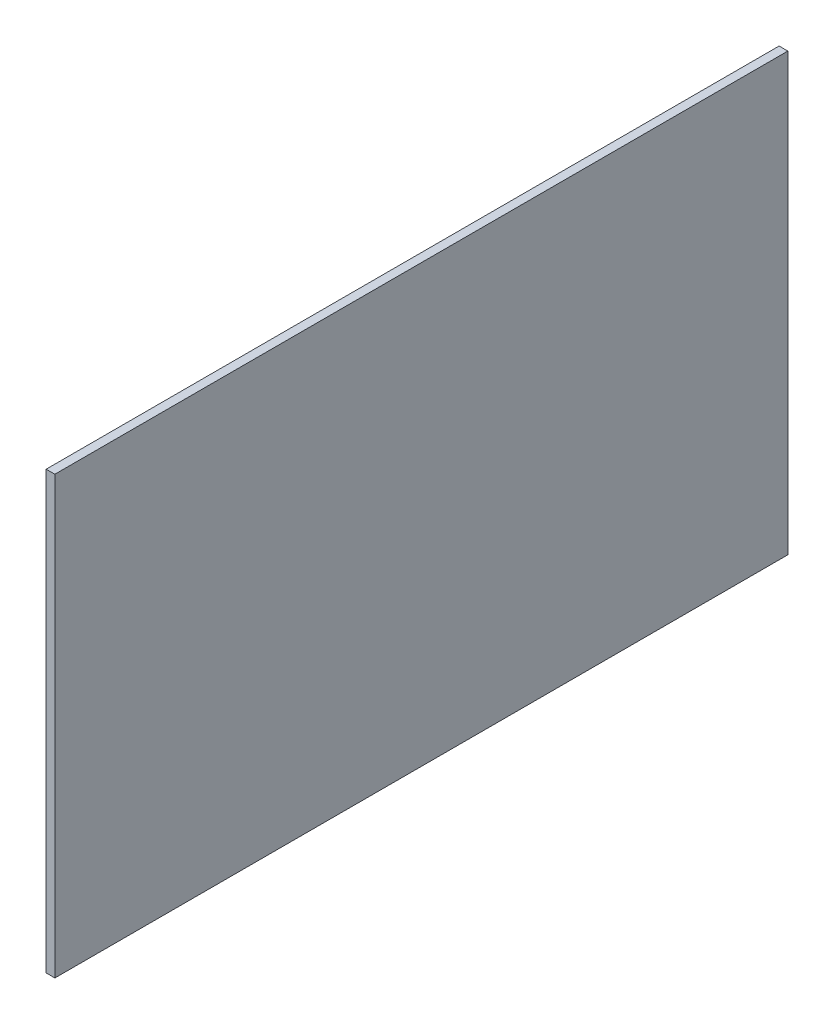
ISO-10303-21;
HEADER;
FILE_DESCRIPTION(('STEP AP214'),'2;1');
FILE_NAME('part.step','',(''),(''),'','','');
FILE_SCHEMA(('AUTOMOTIVE_DESIGN { 1 0 10303 214 1 1 1 1 }'));
ENDSEC;
DATA;
#1=APPLICATION_CONTEXT('core data for automotive mechanical design processes');
#2=APPLICATION_PROTOCOL_DEFINITION('international standard','automotive_design',2000,#1);
#3=PRODUCT_CONTEXT('',#1,'mechanical');
#4=PRODUCT('Part','Part','',(#3));
#5=PRODUCT_RELATED_PRODUCT_CATEGORY('part','',(#4));
#6=PRODUCT_DEFINITION_FORMATION('','',#4);
#7=PRODUCT_DEFINITION_CONTEXT('part definition',#1,'design');
#8=PRODUCT_DEFINITION('design','',#6,#7);
#9=PRODUCT_DEFINITION_SHAPE('','',#8);
#10=(LENGTH_UNIT() NAMED_UNIT(*) SI_UNIT(.MILLI.,.METRE.));
#11=(NAMED_UNIT(*) PLANE_ANGLE_UNIT() SI_UNIT($,.RADIAN.));
#12=(NAMED_UNIT(*) SI_UNIT($,.STERADIAN.) SOLID_ANGLE_UNIT());
#13=UNCERTAINTY_MEASURE_WITH_UNIT(LENGTH_MEASURE(1.E-05),#10,'distance_accuracy_value','');
#14=(GEOMETRIC_REPRESENTATION_CONTEXT(3) GLOBAL_UNCERTAINTY_ASSIGNED_CONTEXT((#13)) GLOBAL_UNIT_ASSIGNED_CONTEXT((#10,
#11,#12)) REPRESENTATION_CONTEXT('',''));
#15=CARTESIAN_POINT('',(0.,0.,0.));
#16=DIRECTION('',(0.,0.,1.));
#17=DIRECTION('',(1.,0.,0.));
#18=AXIS2_PLACEMENT_3D('',#15,#16,#17);
#19=CARTESIAN_POINT('',(304.8,8255.,-12801.6));
#20=DIRECTION('',(0.,0.,1.));
#21=DIRECTION('',(0.,-1.,0.));
#22=AXIS2_PLACEMENT_3D('',#19,#20,#21);
#23=PLANE('',#22);
#24=DIRECTION('',(0.,1.,0.));
#25=VECTOR('',#24,1.);
#26=CARTESIAN_POINT('',(0.,8255.,-12801.6));
#27=LINE('',#26,#25);
#28=CARTESIAN_POINT('',(0.,-6985.,-12801.6));
#29=VERTEX_POINT('',#28);
#30=CARTESIAN_POINT('',(0.,8255.,-12801.6));
#31=VERTEX_POINT('',#30);
#32=EDGE_CURVE('E98',#29,#31,#27,.T.);
#33=ORIENTED_EDGE('',*,*,#32,.T.);
#34=DIRECTION('',(-1.,0.,0.));
#35=VECTOR('',#34,1.);
#36=CARTESIAN_POINT('',(304.8,8255.,-12801.6));
#37=LINE('',#36,#35);
#38=CARTESIAN_POINT('',(304.8,8255.,-12801.6));
#39=VERTEX_POINT('',#38);
#40=EDGE_CURVE('E11',#39,#31,#37,.T.);
#41=ORIENTED_EDGE('',*,*,#40,.F.);
#42=DIRECTION('',(0.,1.,0.));
#43=VECTOR('',#42,1.);
#44=CARTESIAN_POINT('',(304.8,8255.,-12801.6));
#45=LINE('',#44,#43);
#46=CARTESIAN_POINT('',(304.8,-6985.,-12801.6));
#47=VERTEX_POINT('',#46);
#48=EDGE_CURVE('E86',#47,#39,#45,.T.);
#49=ORIENTED_EDGE('',*,*,#48,.F.);
#50=DIRECTION('',(-1.,0.,0.));
#51=VECTOR('',#50,1.);
#52=CARTESIAN_POINT('',(304.8,-6985.,-12801.6));
#53=LINE('',#52,#51);
#54=EDGE_CURVE('E94',#47,#29,#53,.T.);
#55=ORIENTED_EDGE('',*,*,#54,.T.);
#56=EDGE_LOOP('',(#33,#41,#49,#55));
#57=FACE_BOUND('',#56,.T.);
#58=ADVANCED_FACE('F35',(#57),#23,.F.);
#59=CARTESIAN_POINT('',(304.8,8255.,12801.6));
#60=DIRECTION('',(0.,-1.,0.));
#61=DIRECTION('',(0.,0.,-1.));
#62=AXIS2_PLACEMENT_3D('',#59,#60,#61);
#63=PLANE('',#62);
#64=DIRECTION('',(0.,0.,1.));
#65=VECTOR('',#64,1.);
#66=CARTESIAN_POINT('',(0.,8255.,12801.6));
#67=LINE('',#66,#65);
#68=CARTESIAN_POINT('',(0.,8255.,12801.6));
#69=VERTEX_POINT('',#68);
#70=EDGE_CURVE('E90',#31,#69,#67,.T.);
#71=ORIENTED_EDGE('',*,*,#70,.T.);
#72=DIRECTION('',(-1.,0.,0.));
#73=VECTOR('',#72,1.);
#74=CARTESIAN_POINT('',(304.8,8255.,12801.6));
#75=LINE('',#74,#73);
#76=CARTESIAN_POINT('',(304.8,8255.,12801.6));
#77=VERTEX_POINT('',#76);
#78=EDGE_CURVE('E43',#77,#69,#75,.T.);
#79=ORIENTED_EDGE('',*,*,#78,.F.);
#80=DIRECTION('',(0.,0.,1.));
#81=VECTOR('',#80,1.);
#82=CARTESIAN_POINT('',(304.8,8255.,12801.6));
#83=LINE('',#82,#81);
#84=EDGE_CURVE('E81',#39,#77,#83,.T.);
#85=ORIENTED_EDGE('',*,*,#84,.F.);
#86=ORIENTED_EDGE('',*,*,#40,.T.);
#87=EDGE_LOOP('',(#71,#79,#85,#86));
#88=FACE_BOUND('',#87,.T.);
#89=ADVANCED_FACE('F89',(#88),#63,.F.);
#90=CARTESIAN_POINT('',(304.8,8255.,12801.6));
#91=DIRECTION('',(0.,0.,-1.));
#92=DIRECTION('',(-1.,0.,0.));
#93=AXIS2_PLACEMENT_3D('',#90,#91,#92);
#94=PLANE('',#93);
#95=DIRECTION('',(0.,-1.,0.));
#96=VECTOR('',#95,1.);
#97=CARTESIAN_POINT('',(0.,8255.,12801.6));
#98=LINE('',#97,#96);
#99=CARTESIAN_POINT('',(0.,-6985.,12801.6));
#100=VERTEX_POINT('',#99);
#101=EDGE_CURVE('E68',#69,#100,#98,.T.);
#102=ORIENTED_EDGE('',*,*,#101,.T.);
#103=DIRECTION('',(-1.,0.,0.));
#104=VECTOR('',#103,1.);
#105=CARTESIAN_POINT('',(304.8,-6985.,12801.6));
#106=LINE('',#105,#104);
#107=CARTESIAN_POINT('',(304.8,-6985.,12801.6));
#108=VERTEX_POINT('',#107);
#109=EDGE_CURVE('E91',#108,#100,#106,.T.);
#110=ORIENTED_EDGE('',*,*,#109,.F.);
#111=DIRECTION('',(0.,-1.,0.));
#112=VECTOR('',#111,1.);
#113=CARTESIAN_POINT('',(304.8,8255.,12801.6));
#114=LINE('',#113,#112);
#115=EDGE_CURVE('E84',#77,#108,#114,.T.);
#116=ORIENTED_EDGE('',*,*,#115,.F.);
#117=ORIENTED_EDGE('',*,*,#78,.T.);
#118=EDGE_LOOP('',(#102,#110,#116,#117));
#119=FACE_BOUND('',#118,.T.);
#120=ADVANCED_FACE('F92',(#119),#94,.F.);
#121=CARTESIAN_POINT('',(304.8,-6985.,12801.6));
#122=DIRECTION('',(0.,1.,0.));
#123=DIRECTION('',(0.,0.,1.));
#124=AXIS2_PLACEMENT_3D('',#121,#122,#123);
#125=PLANE('',#124);
#126=DIRECTION('',(0.,0.,-1.));
#127=VECTOR('',#126,1.);
#128=CARTESIAN_POINT('',(0.,-6985.,12801.6));
#129=LINE('',#128,#127);
#130=EDGE_CURVE('E74',#100,#29,#129,.T.);
#131=ORIENTED_EDGE('',*,*,#130,.T.);
#132=ORIENTED_EDGE('',*,*,#54,.F.);
#133=DIRECTION('',(0.,0.,-1.));
#134=VECTOR('',#133,1.);
#135=CARTESIAN_POINT('',(304.8,-6985.,12801.6));
#136=LINE('',#135,#134);
#137=EDGE_CURVE('E51',#108,#47,#136,.T.);
#138=ORIENTED_EDGE('',*,*,#137,.F.);
#139=ORIENTED_EDGE('',*,*,#109,.T.);
#140=EDGE_LOOP('',(#131,#132,#138,#139));
#141=FACE_BOUND('',#140,.T.);
#142=ADVANCED_FACE('F105',(#141),#125,.F.);
#143=CARTESIAN_POINT('',(304.8,0.,0.));
#144=DIRECTION('',(1.,0.,0.));
#145=DIRECTION('',(0.,0.,-1.));
#146=AXIS2_PLACEMENT_3D('',#143,#144,#145);
#147=PLANE('',#146);
#148=ORIENTED_EDGE('',*,*,#48,.T.);
#149=ORIENTED_EDGE('',*,*,#84,.T.);
#150=ORIENTED_EDGE('',*,*,#115,.T.);
#151=ORIENTED_EDGE('',*,*,#137,.T.);
#152=EDGE_LOOP('',(#148,#149,#150,#151));
#153=FACE_BOUND('',#152,.T.);
#154=ADVANCED_FACE('F82',(#153),#147,.T.);
#155=CARTESIAN_POINT('',(0.,0.,0.));
#156=DIRECTION('',(1.,0.,0.));
#157=DIRECTION('',(0.,0.,-1.));
#158=AXIS2_PLACEMENT_3D('',#155,#156,#157);
#159=PLANE('',#158);
#160=ORIENTED_EDGE('',*,*,#32,.F.);
#161=ORIENTED_EDGE('',*,*,#130,.F.);
#162=ORIENTED_EDGE('',*,*,#101,.F.);
#163=ORIENTED_EDGE('',*,*,#70,.F.);
#164=EDGE_LOOP('',(#160,#161,#162,#163));
#165=FACE_BOUND('',#164,.T.);
#166=ADVANCED_FACE('F108',(#165),#159,.F.);
#167=CLOSED_SHELL('',(#58,#89,#120,#142,#154,#166));
#168=MANIFOLD_SOLID_BREP('B2',#167);
#169=ADVANCED_BREP_SHAPE_REPRESENTATION('',(#18,#168),#14);
#170=SHAPE_DEFINITION_REPRESENTATION(#9,#169);
ENDSEC;
END-ISO-10303-21;
